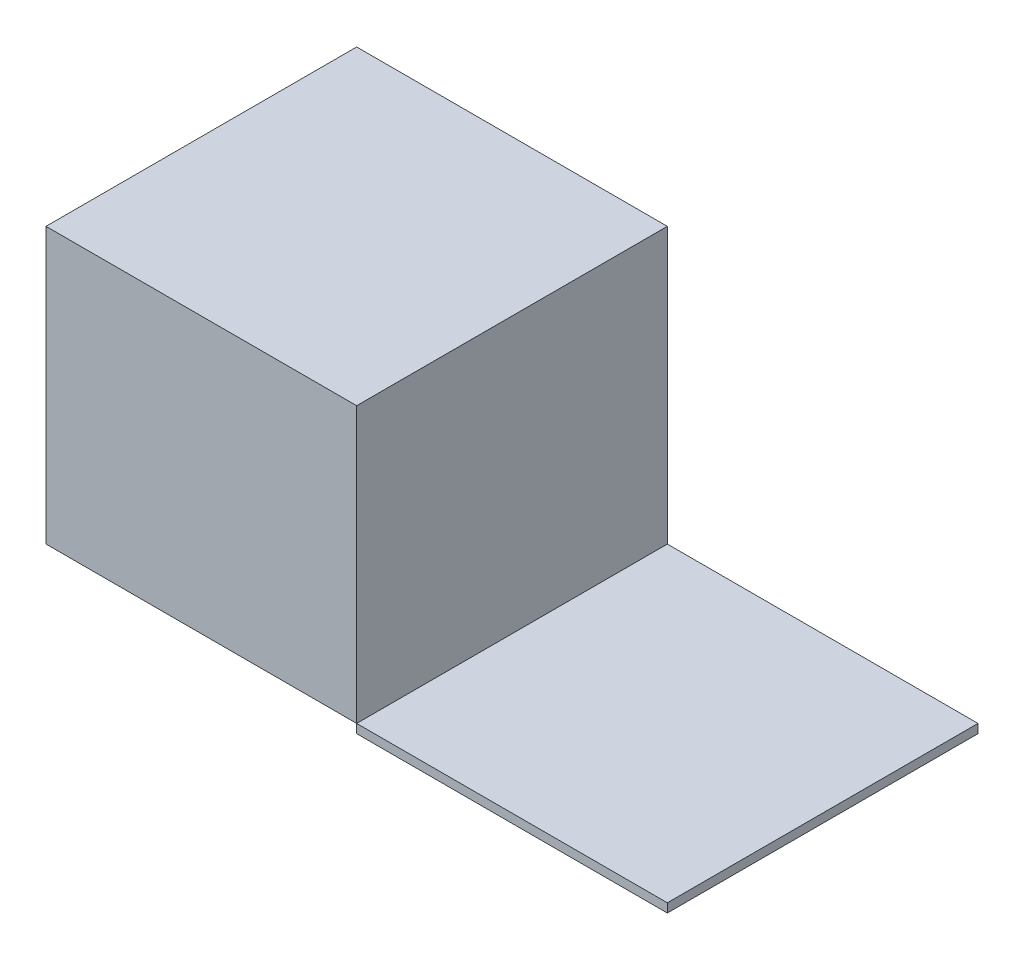
ISO-10303-21;
HEADER;
FILE_DESCRIPTION(('STEP AP214'),'2;1');
FILE_NAME('part.step','',(''),(''),'','','');
FILE_SCHEMA(('AUTOMOTIVE_DESIGN { 1 0 10303 214 1 1 1 1 }'));
ENDSEC;
DATA;
#1=APPLICATION_CONTEXT('core data for automotive mechanical design processes');
#2=APPLICATION_PROTOCOL_DEFINITION('international standard','automotive_design',2000,#1);
#3=PRODUCT_CONTEXT('',#1,'mechanical');
#4=PRODUCT('Part','Part','',(#3));
#5=PRODUCT_RELATED_PRODUCT_CATEGORY('part','',(#4));
#6=PRODUCT_DEFINITION_FORMATION('','',#4);
#7=PRODUCT_DEFINITION_CONTEXT('part definition',#1,'design');
#8=PRODUCT_DEFINITION('design','',#6,#7);
#9=PRODUCT_DEFINITION_SHAPE('','',#8);
#10=(LENGTH_UNIT() NAMED_UNIT(*) SI_UNIT(.MILLI.,.METRE.));
#11=(NAMED_UNIT(*) PLANE_ANGLE_UNIT() SI_UNIT($,.RADIAN.));
#12=(NAMED_UNIT(*) SI_UNIT($,.STERADIAN.) SOLID_ANGLE_UNIT());
#13=UNCERTAINTY_MEASURE_WITH_UNIT(LENGTH_MEASURE(1.E-05),#10,'distance_accuracy_value','');
#14=(GEOMETRIC_REPRESENTATION_CONTEXT(3) GLOBAL_UNCERTAINTY_ASSIGNED_CONTEXT((#13)) GLOBAL_UNIT_ASSIGNED_CONTEXT((#10,
#11,#12)) REPRESENTATION_CONTEXT('',''));
#15=CARTESIAN_POINT('',(0.,0.,0.));
#16=DIRECTION('',(0.,0.,1.));
#17=DIRECTION('',(1.,0.,0.));
#18=AXIS2_PLACEMENT_3D('',#15,#16,#17);
#19=CARTESIAN_POINT('',(35.,-1.,0.));
#20=DIRECTION('',(1.,0.,0.));
#21=DIRECTION('',(0.,0.,-1.));
#22=AXIS2_PLACEMENT_3D('',#19,#20,#21);
#23=PLANE('',#22);
#24=DIRECTION('',(0.,0.,-1.));
#25=VECTOR('',#24,1.);
#26=CARTESIAN_POINT('',(35.,0.,0.));
#27=LINE('',#26,#25);
#28=CARTESIAN_POINT('',(35.,0.,0.));
#29=VERTEX_POINT('',#28);
#30=CARTESIAN_POINT('',(35.,0.,-35.));
#31=VERTEX_POINT('',#30);
#32=EDGE_CURVE('E106',#29,#31,#27,.T.);
#33=ORIENTED_EDGE('',*,*,#32,.T.);
#34=DIRECTION('',(0.,1.,0.));
#35=VECTOR('',#34,1.);
#36=CARTESIAN_POINT('',(35.,-1.,-35.));
#37=LINE('',#36,#35);
#38=CARTESIAN_POINT('',(35.,-1.,-35.));
#39=VERTEX_POINT('',#38);
#40=EDGE_CURVE('E12',#39,#31,#37,.T.);
#41=ORIENTED_EDGE('',*,*,#40,.F.);
#42=DIRECTION('',(0.,0.,-1.));
#43=VECTOR('',#42,1.);
#44=CARTESIAN_POINT('',(35.,-1.,0.));
#45=LINE('',#44,#43);
#46=CARTESIAN_POINT('',(35.,-1.,0.));
#47=VERTEX_POINT('',#46);
#48=EDGE_CURVE('E94',#47,#39,#45,.T.);
#49=ORIENTED_EDGE('',*,*,#48,.F.);
#50=DIRECTION('',(0.,1.,0.));
#51=VECTOR('',#50,1.);
#52=CARTESIAN_POINT('',(35.,-1.,0.));
#53=LINE('',#52,#51);
#54=EDGE_CURVE('E102',#47,#29,#53,.T.);
#55=ORIENTED_EDGE('',*,*,#54,.T.);
#56=EDGE_LOOP('',(#33,#41,#49,#55));
#57=FACE_BOUND('',#56,.T.);
#58=ADVANCED_FACE('F43',(#57),#23,.F.);
#59=CARTESIAN_POINT('',(35.,-1.,-35.));
#60=DIRECTION('',(0.,0.,1.));
#61=DIRECTION('',(1.,0.,0.));
#62=AXIS2_PLACEMENT_3D('',#59,#60,#61);
#63=PLANE('',#62);
#64=DIRECTION('',(1.,0.,0.));
#65=VECTOR('',#64,1.);
#66=CARTESIAN_POINT('',(35.,0.,-35.));
#67=LINE('',#66,#65);
#68=CARTESIAN_POINT('',(70.,0.,-35.));
#69=VERTEX_POINT('',#68);
#70=EDGE_CURVE('E98',#31,#69,#67,.T.);
#71=ORIENTED_EDGE('',*,*,#70,.T.);
#72=DIRECTION('',(0.,1.,0.));
#73=VECTOR('',#72,1.);
#74=CARTESIAN_POINT('',(70.,-1.,-35.));
#75=LINE('',#74,#73);
#76=CARTESIAN_POINT('',(70.,-1.,-35.));
#77=VERTEX_POINT('',#76);
#78=EDGE_CURVE('E51',#77,#69,#75,.T.);
#79=ORIENTED_EDGE('',*,*,#78,.F.);
#80=DIRECTION('',(1.,0.,0.));
#81=VECTOR('',#80,1.);
#82=CARTESIAN_POINT('',(35.,-1.,-35.));
#83=LINE('',#82,#81);
#84=EDGE_CURVE('E89',#39,#77,#83,.T.);
#85=ORIENTED_EDGE('',*,*,#84,.F.);
#86=ORIENTED_EDGE('',*,*,#40,.T.);
#87=EDGE_LOOP('',(#71,#79,#85,#86));
#88=FACE_BOUND('',#87,.T.);
#89=ADVANCED_FACE('F97',(#88),#63,.F.);
#90=CARTESIAN_POINT('',(70.,-1.,0.));
#91=DIRECTION('',(-1.,0.,0.));
#92=DIRECTION('',(0.,0.,1.));
#93=AXIS2_PLACEMENT_3D('',#90,#91,#92);
#94=PLANE('',#93);
#95=DIRECTION('',(0.,0.,1.));
#96=VECTOR('',#95,1.);
#97=CARTESIAN_POINT('',(70.,0.,0.));
#98=LINE('',#97,#96);
#99=CARTESIAN_POINT('',(70.,0.,0.));
#100=VERTEX_POINT('',#99);
#101=EDGE_CURVE('E76',#69,#100,#98,.T.);
#102=ORIENTED_EDGE('',*,*,#101,.T.);
#103=DIRECTION('',(0.,1.,0.));
#104=VECTOR('',#103,1.);
#105=CARTESIAN_POINT('',(70.,-1.,0.));
#106=LINE('',#105,#104);
#107=CARTESIAN_POINT('',(70.,-1.,0.));
#108=VERTEX_POINT('',#107);
#109=EDGE_CURVE('E99',#108,#100,#106,.T.);
#110=ORIENTED_EDGE('',*,*,#109,.F.);
#111=DIRECTION('',(0.,0.,1.));
#112=VECTOR('',#111,1.);
#113=CARTESIAN_POINT('',(70.,-1.,0.));
#114=LINE('',#113,#112);
#115=EDGE_CURVE('E92',#77,#108,#114,.T.);
#116=ORIENTED_EDGE('',*,*,#115,.F.);
#117=ORIENTED_EDGE('',*,*,#78,.T.);
#118=EDGE_LOOP('',(#102,#110,#116,#117));
#119=FACE_BOUND('',#118,.T.);
#120=ADVANCED_FACE('F100',(#119),#94,.F.);
#121=CARTESIAN_POINT('',(35.,-1.,0.));
#122=DIRECTION('',(0.,0.,-1.));
#123=DIRECTION('',(-1.,0.,0.));
#124=AXIS2_PLACEMENT_3D('',#121,#122,#123);
#125=PLANE('',#124);
#126=DIRECTION('',(-1.,0.,0.));
#127=VECTOR('',#126,1.);
#128=CARTESIAN_POINT('',(35.,0.,0.));
#129=LINE('',#128,#127);
#130=EDGE_CURVE('E82',#100,#29,#129,.T.);
#131=ORIENTED_EDGE('',*,*,#130,.T.);
#132=ORIENTED_EDGE('',*,*,#54,.F.);
#133=DIRECTION('',(-1.,0.,0.));
#134=VECTOR('',#133,1.);
#135=CARTESIAN_POINT('',(35.,-1.,0.));
#136=LINE('',#135,#134);
#137=EDGE_CURVE('E59',#108,#47,#136,.T.);
#138=ORIENTED_EDGE('',*,*,#137,.F.);
#139=ORIENTED_EDGE('',*,*,#109,.T.);
#140=EDGE_LOOP('',(#131,#132,#138,#139));
#141=FACE_BOUND('',#140,.T.);
#142=ADVANCED_FACE('F113',(#141),#125,.F.);
#143=CARTESIAN_POINT('',(0.,-1.,0.));
#144=DIRECTION('',(0.,-1.,0.));
#145=DIRECTION('',(0.,0.,-1.));
#146=AXIS2_PLACEMENT_3D('',#143,#144,#145);
#147=PLANE('',#146);
#148=ORIENTED_EDGE('',*,*,#48,.T.);
#149=ORIENTED_EDGE('',*,*,#84,.T.);
#150=ORIENTED_EDGE('',*,*,#115,.T.);
#151=ORIENTED_EDGE('',*,*,#137,.T.);
#152=EDGE_LOOP('',(#148,#149,#150,#151));
#153=FACE_BOUND('',#152,.T.);
#154=ADVANCED_FACE('F90',(#153),#147,.T.);
#155=CARTESIAN_POINT('',(0.,0.,0.));
#156=DIRECTION('',(0.,-1.,0.));
#157=DIRECTION('',(0.,0.,-1.));
#158=AXIS2_PLACEMENT_3D('',#155,#156,#157);
#159=PLANE('',#158);
#160=ORIENTED_EDGE('',*,*,#32,.F.);
#161=ORIENTED_EDGE('',*,*,#130,.F.);
#162=ORIENTED_EDGE('',*,*,#101,.F.);
#163=ORIENTED_EDGE('',*,*,#70,.F.);
#164=EDGE_LOOP('',(#160,#161,#162,#163));
#165=FACE_BOUND('',#164,.T.);
#166=ADVANCED_FACE('F116',(#165),#159,.F.);
#167=CLOSED_SHELL('',(#58,#89,#120,#142,#154,#166));
#168=MANIFOLD_SOLID_BREP('B2',#167);
#169=CARTESIAN_POINT('',(0.,0.,0.));
#170=DIRECTION('',(0.,-1.,0.));
#171=DIRECTION('',(0.,0.,-1.));
#172=AXIS2_PLACEMENT_3D('',#169,#170,#171);
#173=PLANE('',#172);
#174=DIRECTION('',(0.,0.,1.));
#175=VECTOR('',#174,1.);
#176=CARTESIAN_POINT('',(0.,0.,0.));
#177=LINE('',#176,#175);
#178=CARTESIAN_POINT('',(0.,0.,-35.));
#179=VERTEX_POINT('',#178);
#180=CARTESIAN_POINT('',(0.,0.,0.));
#181=VERTEX_POINT('',#180);
#182=EDGE_CURVE('E239',#179,#181,#177,.T.);
#183=ORIENTED_EDGE('',*,*,#182,.F.);
#184=DIRECTION('',(-1.,0.,0.));
#185=VECTOR('',#184,1.);
#186=CARTESIAN_POINT('',(0.,0.,-35.));
#187=LINE('',#186,#185);
#188=CARTESIAN_POINT('',(35.,0.,-35.));
#189=VERTEX_POINT('',#188);
#190=EDGE_CURVE('E190',#189,#179,#187,.T.);
#191=ORIENTED_EDGE('',*,*,#190,.F.);
#192=DIRECTION('',(0.,0.,-1.));
#193=VECTOR('',#192,1.);
#194=CARTESIAN_POINT('',(35.,0.,0.));
#195=LINE('',#194,#193);
#196=CARTESIAN_POINT('',(35.,0.,0.));
#197=VERTEX_POINT('',#196);
#198=EDGE_CURVE('E291',#197,#189,#195,.T.);
#199=ORIENTED_EDGE('',*,*,#198,.F.);
#200=DIRECTION('',(1.,0.,0.));
#201=VECTOR('',#200,1.);
#202=CARTESIAN_POINT('',(0.,0.,0.));
#203=LINE('',#202,#201);
#204=EDGE_CURVE('E289',#181,#197,#203,.T.);
#205=ORIENTED_EDGE('',*,*,#204,.F.);
#206=EDGE_LOOP('',(#183,#191,#199,#205));
#207=FACE_BOUND('',#206,.T.);
#208=DIRECTION('',(-1.,0.,0.));
#209=VECTOR('',#208,1.);
#210=CARTESIAN_POINT('',(1.,0.,-34.));
#211=LINE('',#210,#209);
#212=CARTESIAN_POINT('',(34.,0.,-34.));
#213=VERTEX_POINT('',#212);
#214=CARTESIAN_POINT('',(1.,0.,-34.));
#215=VERTEX_POINT('',#214);
#216=EDGE_CURVE('E262',#213,#215,#211,.T.);
#217=ORIENTED_EDGE('',*,*,#216,.T.);
#218=DIRECTION('',(0.,0.,1.));
#219=VECTOR('',#218,1.);
#220=CARTESIAN_POINT('',(1.,0.,-1.));
#221=LINE('',#220,#219);
#222=CARTESIAN_POINT('',(1.,0.,-1.));
#223=VERTEX_POINT('',#222);
#224=EDGE_CURVE('E182',#215,#223,#221,.T.);
#225=ORIENTED_EDGE('',*,*,#224,.T.);
#226=DIRECTION('',(1.,0.,0.));
#227=VECTOR('',#226,1.);
#228=CARTESIAN_POINT('',(1.,0.,-1.));
#229=LINE('',#228,#227);
#230=CARTESIAN_POINT('',(34.,0.,-1.));
#231=VERTEX_POINT('',#230);
#232=EDGE_CURVE('E273',#223,#231,#229,.T.);
#233=ORIENTED_EDGE('',*,*,#232,.T.);
#234=DIRECTION('',(0.,0.,-1.));
#235=VECTOR('',#234,1.);
#236=CARTESIAN_POINT('',(34.,0.,-1.));
#237=LINE('',#236,#235);
#238=EDGE_CURVE('E276',#231,#213,#237,.T.);
#239=ORIENTED_EDGE('',*,*,#238,.T.);
#240=EDGE_LOOP('',(#217,#225,#233,#239));
#241=FACE_BOUND('',#240,.T.);
#242=ADVANCED_FACE('F167',(#207,#241),#173,.T.);
#243=CARTESIAN_POINT('',(0.,30.,0.));
#244=DIRECTION('',(1.,0.,0.));
#245=DIRECTION('',(0.,0.,-1.));
#246=AXIS2_PLACEMENT_3D('',#243,#244,#245);
#247=PLANE('',#246);
#248=ORIENTED_EDGE('',*,*,#182,.T.);
#249=DIRECTION('',(0.,-1.,0.));
#250=VECTOR('',#249,1.);
#251=CARTESIAN_POINT('',(0.,30.,0.));
#252=LINE('',#251,#250);
#253=CARTESIAN_POINT('',(0.,31.,0.));
#254=VERTEX_POINT('',#253);
#255=EDGE_CURVE('E41',#254,#181,#252,.T.);
#256=ORIENTED_EDGE('',*,*,#255,.F.);
#257=DIRECTION('',(0.,0.,1.));
#258=VECTOR('',#257,1.);
#259=CARTESIAN_POINT('',(0.,31.,0.));
#260=LINE('',#259,#258);
#261=CARTESIAN_POINT('',(0.,31.,-35.));
#262=VERTEX_POINT('',#261);
#263=EDGE_CURVE('E237',#262,#254,#260,.T.);
#264=ORIENTED_EDGE('',*,*,#263,.F.);
#265=DIRECTION('',(0.,-1.,0.));
#266=VECTOR('',#265,1.);
#267=CARTESIAN_POINT('',(0.,30.,-35.));
#268=LINE('',#267,#266);
#269=EDGE_CURVE('E294',#262,#179,#268,.T.);
#270=ORIENTED_EDGE('',*,*,#269,.T.);
#271=EDGE_LOOP('',(#248,#256,#264,#270));
#272=FACE_BOUND('',#271,.T.);
#273=ADVANCED_FACE('F169',(#272),#247,.F.);
#274=CARTESIAN_POINT('',(0.,30.,0.));
#275=DIRECTION('',(0.,0.,-1.));
#276=DIRECTION('',(-1.,0.,0.));
#277=AXIS2_PLACEMENT_3D('',#274,#275,#276);
#278=PLANE('',#277);
#279=ORIENTED_EDGE('',*,*,#204,.T.);
#280=DIRECTION('',(0.,-1.,0.));
#281=VECTOR('',#280,1.);
#282=CARTESIAN_POINT('',(35.,30.,0.));
#283=LINE('',#282,#281);
#284=CARTESIAN_POINT('',(35.,31.,0.));
#285=VERTEX_POINT('',#284);
#286=EDGE_CURVE('E175',#285,#197,#283,.T.);
#287=ORIENTED_EDGE('',*,*,#286,.F.);
#288=DIRECTION('',(1.,0.,0.));
#289=VECTOR('',#288,1.);
#290=CARTESIAN_POINT('',(0.,31.,0.));
#291=LINE('',#290,#289);
#292=EDGE_CURVE('E242',#254,#285,#291,.T.);
#293=ORIENTED_EDGE('',*,*,#292,.F.);
#294=ORIENTED_EDGE('',*,*,#255,.T.);
#295=EDGE_LOOP('',(#279,#287,#293,#294));
#296=FACE_BOUND('',#295,.T.);
#297=ADVANCED_FACE('F243',(#296),#278,.F.);
#298=CARTESIAN_POINT('',(35.,30.,0.));
#299=DIRECTION('',(-1.,0.,0.));
#300=DIRECTION('',(0.,0.,1.));
#301=AXIS2_PLACEMENT_3D('',#298,#299,#300);
#302=PLANE('',#301);
#303=ORIENTED_EDGE('',*,*,#198,.T.);
#304=DIRECTION('',(0.,-1.,0.));
#305=VECTOR('',#304,1.);
#306=CARTESIAN_POINT('',(35.,30.,-35.));
#307=LINE('',#306,#305);
#308=CARTESIAN_POINT('',(35.,31.,-35.));
#309=VERTEX_POINT('',#308);
#310=EDGE_CURVE('E296',#309,#189,#307,.T.);
#311=ORIENTED_EDGE('',*,*,#310,.F.);
#312=DIRECTION('',(0.,0.,-1.));
#313=VECTOR('',#312,1.);
#314=CARTESIAN_POINT('',(35.,31.,0.));
#315=LINE('',#314,#313);
#316=EDGE_CURVE('E248',#285,#309,#315,.T.);
#317=ORIENTED_EDGE('',*,*,#316,.F.);
#318=ORIENTED_EDGE('',*,*,#286,.T.);
#319=EDGE_LOOP('',(#303,#311,#317,#318));
#320=FACE_BOUND('',#319,.T.);
#321=ADVANCED_FACE('F299',(#320),#302,.F.);
#322=CARTESIAN_POINT('',(0.,30.,-35.));
#323=DIRECTION('',(0.,0.,1.));
#324=DIRECTION('',(1.,0.,0.));
#325=AXIS2_PLACEMENT_3D('',#322,#323,#324);
#326=PLANE('',#325);
#327=ORIENTED_EDGE('',*,*,#190,.T.);
#328=ORIENTED_EDGE('',*,*,#269,.F.);
#329=DIRECTION('',(-1.,0.,0.));
#330=VECTOR('',#329,1.);
#331=CARTESIAN_POINT('',(0.,31.,-35.));
#332=LINE('',#331,#330);
#333=EDGE_CURVE('E253',#309,#262,#332,.T.);
#334=ORIENTED_EDGE('',*,*,#333,.F.);
#335=ORIENTED_EDGE('',*,*,#310,.T.);
#336=EDGE_LOOP('',(#327,#328,#334,#335));
#337=FACE_BOUND('',#336,.T.);
#338=ADVANCED_FACE('F332',(#337),#326,.F.);
#339=CARTESIAN_POINT('',(1.,30.,-1.));
#340=DIRECTION('',(1.,0.,0.));
#341=DIRECTION('',(0.,0.,-1.));
#342=AXIS2_PLACEMENT_3D('',#339,#340,#341);
#343=PLANE('',#342);
#344=ORIENTED_EDGE('',*,*,#224,.F.);
#345=DIRECTION('',(0.,-1.,0.));
#346=VECTOR('',#345,1.);
#347=CARTESIAN_POINT('',(1.,30.,-34.));
#348=LINE('',#347,#346);
#349=CARTESIAN_POINT('',(1.,30.,-34.));
#350=VERTEX_POINT('',#349);
#351=EDGE_CURVE('E271',#350,#215,#348,.T.);
#352=ORIENTED_EDGE('',*,*,#351,.F.);
#353=DIRECTION('',(0.,0.,1.));
#354=VECTOR('',#353,1.);
#355=CARTESIAN_POINT('',(1.,30.,-1.));
#356=LINE('',#355,#354);
#357=CARTESIAN_POINT('',(1.,30.,-1.));
#358=VERTEX_POINT('',#357);
#359=EDGE_CURVE('E258',#350,#358,#356,.T.);
#360=ORIENTED_EDGE('',*,*,#359,.T.);
#361=DIRECTION('',(0.,-1.,0.));
#362=VECTOR('',#361,1.);
#363=CARTESIAN_POINT('',(1.,30.,-1.));
#364=LINE('',#363,#362);
#365=EDGE_CURVE('E286',#358,#223,#364,.T.);
#366=ORIENTED_EDGE('',*,*,#365,.T.);
#367=EDGE_LOOP('',(#344,#352,#360,#366));
#368=FACE_BOUND('',#367,.T.);
#369=ADVANCED_FACE('F309',(#368),#343,.T.);
#370=CARTESIAN_POINT('',(1.,30.,-1.));
#371=DIRECTION('',(0.,0.,-1.));
#372=DIRECTION('',(-1.,0.,0.));
#373=AXIS2_PLACEMENT_3D('',#370,#371,#372);
#374=PLANE('',#373);
#375=ORIENTED_EDGE('',*,*,#232,.F.);
#376=ORIENTED_EDGE('',*,*,#365,.F.);
#377=DIRECTION('',(1.,0.,0.));
#378=VECTOR('',#377,1.);
#379=CARTESIAN_POINT('',(1.,30.,-1.));
#380=LINE('',#379,#378);
#381=CARTESIAN_POINT('',(34.,30.,-1.));
#382=VERTEX_POINT('',#381);
#383=EDGE_CURVE('E261',#358,#382,#380,.T.);
#384=ORIENTED_EDGE('',*,*,#383,.T.);
#385=DIRECTION('',(0.,-1.,0.));
#386=VECTOR('',#385,1.);
#387=CARTESIAN_POINT('',(34.,30.,-1.));
#388=LINE('',#387,#386);
#389=EDGE_CURVE('E284',#382,#231,#388,.T.);
#390=ORIENTED_EDGE('',*,*,#389,.T.);
#391=EDGE_LOOP('',(#375,#376,#384,#390));
#392=FACE_BOUND('',#391,.T.);
#393=ADVANCED_FACE('F313',(#392),#374,.T.);
#394=CARTESIAN_POINT('',(34.,30.,-1.));
#395=DIRECTION('',(-1.,0.,0.));
#396=DIRECTION('',(0.,0.,1.));
#397=AXIS2_PLACEMENT_3D('',#394,#395,#396);
#398=PLANE('',#397);
#399=ORIENTED_EDGE('',*,*,#238,.F.);
#400=ORIENTED_EDGE('',*,*,#389,.F.);
#401=DIRECTION('',(0.,0.,-1.));
#402=VECTOR('',#401,1.);
#403=CARTESIAN_POINT('',(34.,30.,-1.));
#404=LINE('',#403,#402);
#405=CARTESIAN_POINT('',(34.,30.,-34.));
#406=VERTEX_POINT('',#405);
#407=EDGE_CURVE('E265',#382,#406,#404,.T.);
#408=ORIENTED_EDGE('',*,*,#407,.T.);
#409=DIRECTION('',(0.,-1.,0.));
#410=VECTOR('',#409,1.);
#411=CARTESIAN_POINT('',(34.,30.,-34.));
#412=LINE('',#411,#410);
#413=EDGE_CURVE('E282',#406,#213,#412,.T.);
#414=ORIENTED_EDGE('',*,*,#413,.T.);
#415=EDGE_LOOP('',(#399,#400,#408,#414));
#416=FACE_BOUND('',#415,.T.);
#417=ADVANCED_FACE('F316',(#416),#398,.T.);
#418=CARTESIAN_POINT('',(1.,30.,-34.));
#419=DIRECTION('',(0.,0.,1.));
#420=DIRECTION('',(1.,0.,0.));
#421=AXIS2_PLACEMENT_3D('',#418,#419,#420);
#422=PLANE('',#421);
#423=ORIENTED_EDGE('',*,*,#216,.F.);
#424=ORIENTED_EDGE('',*,*,#413,.F.);
#425=DIRECTION('',(-1.,0.,0.));
#426=VECTOR('',#425,1.);
#427=CARTESIAN_POINT('',(1.,30.,-34.));
#428=LINE('',#427,#426);
#429=EDGE_CURVE('E268',#406,#350,#428,.T.);
#430=ORIENTED_EDGE('',*,*,#429,.T.);
#431=ORIENTED_EDGE('',*,*,#351,.T.);
#432=EDGE_LOOP('',(#423,#424,#430,#431));
#433=FACE_BOUND('',#432,.T.);
#434=ADVANCED_FACE('F308',(#433),#422,.T.);
#435=CARTESIAN_POINT('',(0.,30.,0.));
#436=DIRECTION('',(0.,-1.,0.));
#437=DIRECTION('',(0.,0.,-1.));
#438=AXIS2_PLACEMENT_3D('',#435,#436,#437);
#439=PLANE('',#438);
#440=ORIENTED_EDGE('',*,*,#383,.F.);
#441=ORIENTED_EDGE('',*,*,#359,.F.);
#442=ORIENTED_EDGE('',*,*,#429,.F.);
#443=ORIENTED_EDGE('',*,*,#407,.F.);
#444=EDGE_LOOP('',(#440,#441,#442,#443));
#445=FACE_BOUND('',#444,.T.);
#446=ADVANCED_FACE('F317',(#445),#439,.T.);
#447=CARTESIAN_POINT('',(0.,31.,0.));
#448=DIRECTION('',(0.,-1.,0.));
#449=DIRECTION('',(0.,0.,-1.));
#450=AXIS2_PLACEMENT_3D('',#447,#448,#449);
#451=PLANE('',#450);
#452=ORIENTED_EDGE('',*,*,#263,.T.);
#453=ORIENTED_EDGE('',*,*,#292,.T.);
#454=ORIENTED_EDGE('',*,*,#316,.T.);
#455=ORIENTED_EDGE('',*,*,#333,.T.);
#456=EDGE_LOOP('',(#452,#453,#454,#455));
#457=FACE_BOUND('',#456,.T.);
#458=ADVANCED_FACE('F251',(#457),#451,.F.);
#459=CLOSED_SHELL('',(#242,#273,#297,#321,#338,#369,#393,#417,#434,#446,#458));
#460=MANIFOLD_SOLID_BREP('B6',#459);
#461=ADVANCED_BREP_SHAPE_REPRESENTATION('',(#18,#168,#460),#14);
#462=SHAPE_DEFINITION_REPRESENTATION(#9,#461);
ENDSEC;
END-ISO-10303-21;
